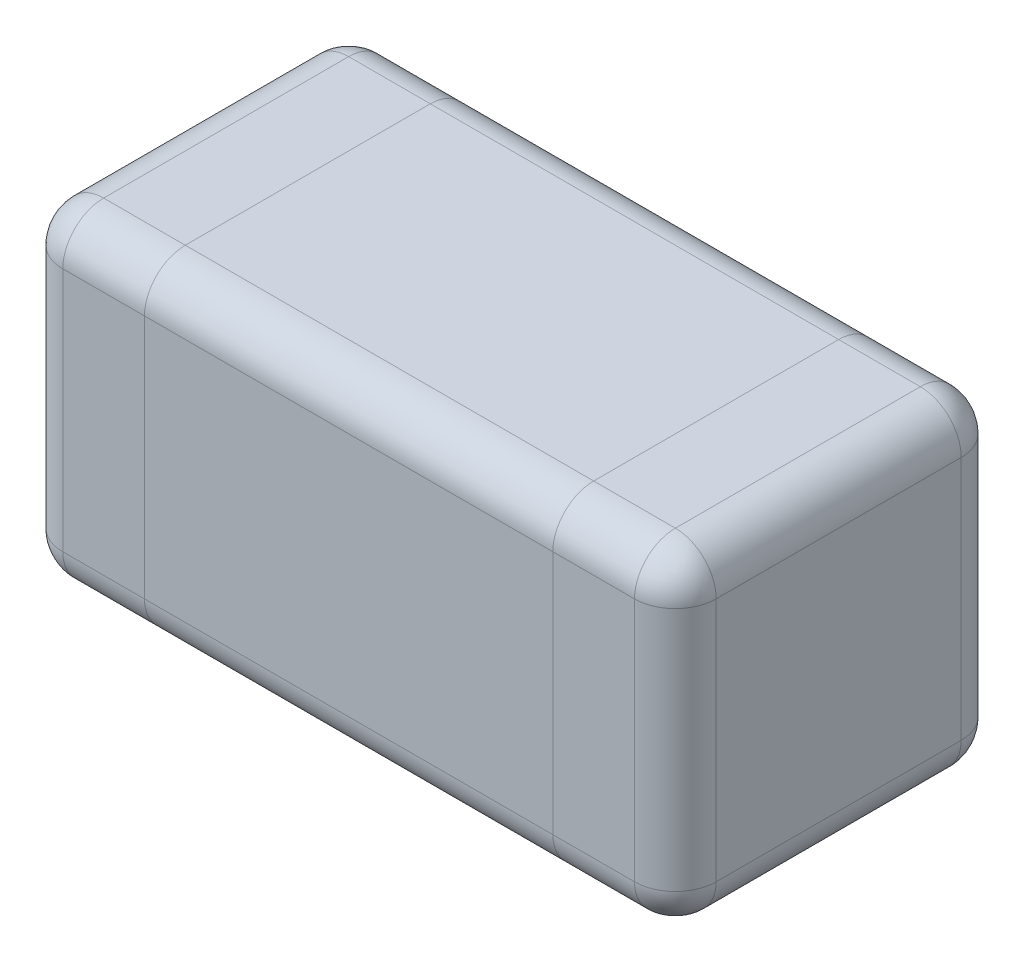
ISO-10303-21;
HEADER;
FILE_DESCRIPTION(('STEP AP214'),'2;1');
FILE_NAME('part.step','',(''),(''),'','','');
FILE_SCHEMA(('AUTOMOTIVE_DESIGN { 1 0 10303 214 1 1 1 1 }'));
ENDSEC;
DATA;
#1=APPLICATION_CONTEXT('core data for automotive mechanical design processes');
#2=APPLICATION_PROTOCOL_DEFINITION('international standard','automotive_design',2000,#1);
#3=PRODUCT_CONTEXT('',#1,'mechanical');
#4=PRODUCT('Part','Part','',(#3));
#5=PRODUCT_RELATED_PRODUCT_CATEGORY('part','',(#4));
#6=PRODUCT_DEFINITION_FORMATION('','',#4);
#7=PRODUCT_DEFINITION_CONTEXT('part definition',#1,'design');
#8=PRODUCT_DEFINITION('design','',#6,#7);
#9=PRODUCT_DEFINITION_SHAPE('','',#8);
#10=(LENGTH_UNIT() NAMED_UNIT(*) SI_UNIT(.MILLI.,.METRE.));
#11=(NAMED_UNIT(*) PLANE_ANGLE_UNIT() SI_UNIT($,.RADIAN.));
#12=(NAMED_UNIT(*) SI_UNIT($,.STERADIAN.) SOLID_ANGLE_UNIT());
#13=UNCERTAINTY_MEASURE_WITH_UNIT(LENGTH_MEASURE(1.E-05),#10,'distance_accuracy_value','');
#14=(GEOMETRIC_REPRESENTATION_CONTEXT(3) GLOBAL_UNCERTAINTY_ASSIGNED_CONTEXT((#13)) GLOBAL_UNIT_ASSIGNED_CONTEXT((#10,
#11,#12)) REPRESENTATION_CONTEXT('',''));
#15=CARTESIAN_POINT('',(0.,0.,0.));
#16=DIRECTION('',(0.,0.,1.));
#17=DIRECTION('',(1.,0.,0.));
#18=AXIS2_PLACEMENT_3D('',#15,#16,#17);
#19=CARTESIAN_POINT('',(0.7,-0.3,0.7));
#20=DIRECTION('',(0.,1.,0.));
#21=DIRECTION('',(1.,0.,0.));
#22=AXIS2_PLACEMENT_3D('',#19,#20,#21);
#23=SPHERICAL_SURFACE('',#22,0.1);
#24=CARTESIAN_POINT('',(0.7,-0.3,0.7));
#25=DIRECTION('',(0.,0.,1.));
#26=DIRECTION('',(1.,0.,0.));
#27=AXIS2_PLACEMENT_3D('',#24,#25,#26);
#28=CIRCLE('',#27,0.1);
#29=CARTESIAN_POINT('',(0.7,-0.4,0.7));
#30=VERTEX_POINT('',#29);
#31=CARTESIAN_POINT('',(0.8,-0.3,0.7));
#32=VERTEX_POINT('',#31);
#33=EDGE_CURVE('E29',#30,#32,#28,.T.);
#34=ORIENTED_EDGE('',*,*,#33,.T.);
#35=CARTESIAN_POINT('',(0.7,-0.3,0.7));
#36=DIRECTION('',(0.,-1.,0.));
#37=DIRECTION('',(1.,0.,0.));
#38=AXIS2_PLACEMENT_3D('',#35,#36,#37);
#39=CIRCLE('',#38,0.1);
#40=CARTESIAN_POINT('',(0.7,-0.3,0.8));
#41=VERTEX_POINT('',#40);
#42=EDGE_CURVE('E228',#32,#41,#39,.T.);
#43=ORIENTED_EDGE('',*,*,#42,.T.);
#44=CARTESIAN_POINT('',(0.7,-0.3,0.7));
#45=DIRECTION('',(-1.,0.,0.));
#46=DIRECTION('',(0.,0.,1.));
#47=AXIS2_PLACEMENT_3D('',#44,#45,#46);
#48=CIRCLE('',#47,0.1);
#49=EDGE_CURVE('E260',#30,#41,#48,.T.);
#50=ORIENTED_EDGE('',*,*,#49,.F.);
#51=EDGE_LOOP('',(#34,#43,#50));
#52=FACE_BOUND('',#51,.T.);
#53=ADVANCED_FACE('F18',(#52),#23,.T.);
#54=CARTESIAN_POINT('',(0.8,-0.4,0.));
#55=DIRECTION('',(0.,-1.,0.));
#56=DIRECTION('',(-1.,0.,0.));
#57=AXIS2_PLACEMENT_3D('',#54,#55,#56);
#58=PLANE('',#57);
#59=DIRECTION('',(0.,0.,1.));
#60=VECTOR('',#59,1.);
#61=CARTESIAN_POINT('',(0.5,-0.4,0.));
#62=LINE('',#61,#60);
#63=CARTESIAN_POINT('',(0.5,-0.4,0.1));
#64=VERTEX_POINT('',#63);
#65=CARTESIAN_POINT('',(0.5,-0.4,0.7));
#66=VERTEX_POINT('',#65);
#67=EDGE_CURVE('E336',#64,#66,#62,.T.);
#68=ORIENTED_EDGE('',*,*,#67,.F.);
#69=DIRECTION('',(-1.,0.,0.));
#70=VECTOR('',#69,1.);
#71=CARTESIAN_POINT('',(0.8,-0.4,0.1));
#72=LINE('',#71,#70);
#73=CARTESIAN_POINT('',(0.7,-0.4,0.1));
#74=VERTEX_POINT('',#73);
#75=EDGE_CURVE('E317',#74,#64,#72,.T.);
#76=ORIENTED_EDGE('',*,*,#75,.F.);
#77=DIRECTION('',(0.,0.,1.));
#78=VECTOR('',#77,1.);
#79=CARTESIAN_POINT('',(0.7,-0.4,0.));
#80=LINE('',#79,#78);
#81=EDGE_CURVE('E11',#74,#30,#80,.T.);
#82=ORIENTED_EDGE('',*,*,#81,.T.);
#83=DIRECTION('',(-1.,0.,0.));
#84=VECTOR('',#83,1.);
#85=CARTESIAN_POINT('',(0.8,-0.4,0.7));
#86=LINE('',#85,#84);
#87=EDGE_CURVE('E233',#30,#66,#86,.T.);
#88=ORIENTED_EDGE('',*,*,#87,.T.);
#89=EDGE_LOOP('',(#68,#76,#82,#88));
#90=FACE_BOUND('',#89,.T.);
#91=ADVANCED_FACE('F876',(#90),#58,.T.);
#92=CARTESIAN_POINT('',(0.7,-0.3,0.1));
#93=DIRECTION('',(0.,1.,0.));
#94=DIRECTION('',(1.,0.,0.));
#95=AXIS2_PLACEMENT_3D('',#92,#93,#94);
#96=SPHERICAL_SURFACE('',#95,0.1);
#97=CARTESIAN_POINT('',(0.7,-0.3,0.1));
#98=DIRECTION('',(0.,0.,1.));
#99=DIRECTION('',(1.,0.,0.));
#100=AXIS2_PLACEMENT_3D('',#97,#98,#99);
#101=CIRCLE('',#100,0.1);
#102=CARTESIAN_POINT('',(0.8,-0.3,0.1));
#103=VERTEX_POINT('',#102);
#104=EDGE_CURVE('E232',#74,#103,#101,.T.);
#105=ORIENTED_EDGE('',*,*,#104,.F.);
#106=CARTESIAN_POINT('',(0.7,-0.3,0.1));
#107=DIRECTION('',(1.,0.,0.));
#108=DIRECTION('',(0.,0.,-1.));
#109=AXIS2_PLACEMENT_3D('',#106,#107,#108);
#110=CIRCLE('',#109,0.1);
#111=CARTESIAN_POINT('',(0.7,-0.3,0.));
#112=VERTEX_POINT('',#111);
#113=EDGE_CURVE('E152',#74,#112,#110,.T.);
#114=ORIENTED_EDGE('',*,*,#113,.T.);
#115=CARTESIAN_POINT('',(0.7,-0.3,0.1));
#116=DIRECTION('',(0.,1.,0.));
#117=DIRECTION('',(1.,0.,0.));
#118=AXIS2_PLACEMENT_3D('',#115,#116,#117);
#119=CIRCLE('',#118,0.1);
#120=EDGE_CURVE('E321',#103,#112,#119,.T.);
#121=ORIENTED_EDGE('',*,*,#120,.F.);
#122=EDGE_LOOP('',(#105,#114,#121));
#123=FACE_BOUND('',#122,.T.);
#124=ADVANCED_FACE('F880',(#123),#96,.T.);
#125=CARTESIAN_POINT('',(-0.7,-0.3,0.7));
#126=DIRECTION('',(0.,0.,-1.));
#127=DIRECTION('',(-1.,0.,0.));
#128=AXIS2_PLACEMENT_3D('',#125,#126,#127);
#129=SPHERICAL_SURFACE('',#128,0.1);
#130=CARTESIAN_POINT('',(-0.7,-0.3,0.7));
#131=DIRECTION('',(0.,-1.,0.));
#132=DIRECTION('',(-1.,0.,0.));
#133=AXIS2_PLACEMENT_3D('',#130,#131,#132);
#134=CIRCLE('',#133,0.1);
#135=CARTESIAN_POINT('',(-0.7,-0.3,0.8));
#136=VERTEX_POINT('',#135);
#137=CARTESIAN_POINT('',(-0.8,-0.3,0.7));
#138=VERTEX_POINT('',#137);
#139=EDGE_CURVE('E147',#136,#138,#134,.T.);
#140=ORIENTED_EDGE('',*,*,#139,.T.);
#141=CARTESIAN_POINT('',(-0.7,-0.3,0.7));
#142=DIRECTION('',(0.,0.,1.));
#143=DIRECTION('',(-1.,0.,0.));
#144=AXIS2_PLACEMENT_3D('',#141,#142,#143);
#145=CIRCLE('',#144,0.1);
#146=CARTESIAN_POINT('',(-0.7,-0.4,0.7));
#147=VERTEX_POINT('',#146);
#148=EDGE_CURVE('E141',#138,#147,#145,.T.);
#149=ORIENTED_EDGE('',*,*,#148,.T.);
#150=CARTESIAN_POINT('',(-0.7,-0.3,0.7));
#151=DIRECTION('',(1.,0.,0.));
#152=DIRECTION('',(0.,-1.,0.));
#153=AXIS2_PLACEMENT_3D('',#150,#151,#152);
#154=CIRCLE('',#153,0.1);
#155=EDGE_CURVE('E145',#136,#147,#154,.T.);
#156=ORIENTED_EDGE('',*,*,#155,.F.);
#157=EDGE_LOOP('',(#140,#149,#156));
#158=FACE_BOUND('',#157,.T.);
#159=ADVANCED_FACE('F143',(#158),#129,.T.);
#160=CARTESIAN_POINT('',(-0.5,-0.4,0.));
#161=DIRECTION('',(0.,-1.,0.));
#162=DIRECTION('',(0.,0.,-1.));
#163=AXIS2_PLACEMENT_3D('',#160,#161,#162);
#164=PLANE('',#163);
#165=DIRECTION('',(0.,0.,1.));
#166=VECTOR('',#165,1.);
#167=CARTESIAN_POINT('',(-0.5,-0.4,0.));
#168=LINE('',#167,#166);
#169=CARTESIAN_POINT('',(-0.5,-0.4,0.1));
#170=VERTEX_POINT('',#169);
#171=CARTESIAN_POINT('',(-0.5,-0.4,0.7));
#172=VERTEX_POINT('',#171);
#173=EDGE_CURVE('E170',#170,#172,#168,.T.);
#174=ORIENTED_EDGE('',*,*,#173,.T.);
#175=DIRECTION('',(-1.,0.,0.));
#176=VECTOR('',#175,1.);
#177=CARTESIAN_POINT('',(-0.5,-0.4,0.7));
#178=LINE('',#177,#176);
#179=EDGE_CURVE('E167',#172,#147,#178,.T.);
#180=ORIENTED_EDGE('',*,*,#179,.T.);
#181=DIRECTION('',(0.,0.,1.));
#182=VECTOR('',#181,1.);
#183=CARTESIAN_POINT('',(-0.7,-0.4,0.));
#184=LINE('',#183,#182);
#185=CARTESIAN_POINT('',(-0.7,-0.4,0.1));
#186=VERTEX_POINT('',#185);
#187=EDGE_CURVE('E153',#186,#147,#184,.T.);
#188=ORIENTED_EDGE('',*,*,#187,.F.);
#189=DIRECTION('',(-1.,0.,0.));
#190=VECTOR('',#189,1.);
#191=CARTESIAN_POINT('',(-0.5,-0.4,0.1));
#192=LINE('',#191,#190);
#193=EDGE_CURVE('E205',#170,#186,#192,.T.);
#194=ORIENTED_EDGE('',*,*,#193,.F.);
#195=EDGE_LOOP('',(#174,#180,#188,#194));
#196=FACE_BOUND('',#195,.T.);
#197=ADVANCED_FACE('F168',(#196),#164,.T.);
#198=CARTESIAN_POINT('',(-0.7,-0.3,0.1));
#199=DIRECTION('',(0.,1.,0.));
#200=DIRECTION('',(-1.,0.,0.));
#201=AXIS2_PLACEMENT_3D('',#198,#199,#200);
#202=SPHERICAL_SURFACE('',#201,0.1);
#203=CARTESIAN_POINT('',(-0.7,-0.3,0.1));
#204=DIRECTION('',(0.,0.,-1.));
#205=DIRECTION('',(-1.,0.,0.));
#206=AXIS2_PLACEMENT_3D('',#203,#204,#205);
#207=CIRCLE('',#206,0.1);
#208=CARTESIAN_POINT('',(-0.8,-0.3,0.1));
#209=VERTEX_POINT('',#208);
#210=EDGE_CURVE('E159',#186,#209,#207,.T.);
#211=ORIENTED_EDGE('',*,*,#210,.T.);
#212=CARTESIAN_POINT('',(-0.7,-0.3,0.1));
#213=DIRECTION('',(0.,-1.,0.));
#214=DIRECTION('',(-1.,0.,0.));
#215=AXIS2_PLACEMENT_3D('',#212,#213,#214);
#216=CIRCLE('',#215,0.1);
#217=CARTESIAN_POINT('',(-0.7,-0.3,0.));
#218=VERTEX_POINT('',#217);
#219=EDGE_CURVE('E290',#209,#218,#216,.T.);
#220=ORIENTED_EDGE('',*,*,#219,.T.);
#221=CARTESIAN_POINT('',(-0.7,-0.3,0.1));
#222=DIRECTION('',(1.,0.,0.));
#223=DIRECTION('',(0.,0.,-1.));
#224=AXIS2_PLACEMENT_3D('',#221,#222,#223);
#225=CIRCLE('',#224,0.1);
#226=EDGE_CURVE('E186',#186,#218,#225,.T.);
#227=ORIENTED_EDGE('',*,*,#226,.F.);
#228=EDGE_LOOP('',(#211,#220,#227));
#229=FACE_BOUND('',#228,.T.);
#230=ADVANCED_FACE('F908',(#229),#202,.T.);
#231=CARTESIAN_POINT('',(0.7,-0.3,0.));
#232=DIRECTION('',(0.,0.,1.));
#233=DIRECTION('',(0.,-1.,0.));
#234=AXIS2_PLACEMENT_3D('',#231,#232,#233);
#235=CYLINDRICAL_SURFACE('',#234,0.1);
#236=ORIENTED_EDGE('',*,*,#104,.T.);
#237=DIRECTION('',(0.,0.,1.));
#238=VECTOR('',#237,1.);
#239=CARTESIAN_POINT('',(0.8,-0.3,0.));
#240=LINE('',#239,#238);
#241=EDGE_CURVE('E286',#103,#32,#240,.T.);
#242=ORIENTED_EDGE('',*,*,#241,.T.);
#243=ORIENTED_EDGE('',*,*,#33,.F.);
#244=ORIENTED_EDGE('',*,*,#81,.F.);
#245=EDGE_LOOP('',(#236,#242,#243,#244));
#246=FACE_BOUND('',#245,.T.);
#247=ADVANCED_FACE('F871',(#246),#235,.T.);
#248=CARTESIAN_POINT('',(0.7,0.4,0.7));
#249=DIRECTION('',(0.,-1.,0.));
#250=DIRECTION('',(1.,0.,0.));
#251=AXIS2_PLACEMENT_3D('',#248,#249,#250);
#252=CYLINDRICAL_SURFACE('',#251,0.1);
#253=DIRECTION('',(0.,-1.,0.));
#254=VECTOR('',#253,1.);
#255=CARTESIAN_POINT('',(0.8,0.4,0.7));
#256=LINE('',#255,#254);
#257=CARTESIAN_POINT('',(0.8,0.3,0.7));
#258=VERTEX_POINT('',#257);
#259=EDGE_CURVE('E22',#258,#32,#256,.T.);
#260=ORIENTED_EDGE('',*,*,#259,.F.);
#261=CARTESIAN_POINT('',(0.7,0.3,0.7));
#262=DIRECTION('',(0.,-1.,0.));
#263=DIRECTION('',(1.,0.,0.));
#264=AXIS2_PLACEMENT_3D('',#261,#262,#263);
#265=CIRCLE('',#264,0.1);
#266=CARTESIAN_POINT('',(0.7,0.3,0.8));
#267=VERTEX_POINT('',#266);
#268=EDGE_CURVE('E326',#258,#267,#265,.T.);
#269=ORIENTED_EDGE('',*,*,#268,.T.);
#270=DIRECTION('',(0.,-1.,0.));
#271=VECTOR('',#270,1.);
#272=CARTESIAN_POINT('',(0.7,0.4,0.8));
#273=LINE('',#272,#271);
#274=EDGE_CURVE('E245',#267,#41,#273,.T.);
#275=ORIENTED_EDGE('',*,*,#274,.T.);
#276=ORIENTED_EDGE('',*,*,#42,.F.);
#277=EDGE_LOOP('',(#260,#269,#275,#276));
#278=FACE_BOUND('',#277,.T.);
#279=ADVANCED_FACE('F867',(#278),#252,.T.);
#280=CARTESIAN_POINT('',(0.8,-0.3,0.7));
#281=DIRECTION('',(-1.,0.,0.));
#282=DIRECTION('',(0.,-1.,0.));
#283=AXIS2_PLACEMENT_3D('',#280,#281,#282);
#284=CYLINDRICAL_SURFACE('',#283,0.1);
#285=ORIENTED_EDGE('',*,*,#49,.T.);
#286=DIRECTION('',(-1.,0.,0.));
#287=VECTOR('',#286,1.);
#288=CARTESIAN_POINT('',(0.8,-0.3,0.8));
#289=LINE('',#288,#287);
#290=CARTESIAN_POINT('',(0.5,-0.3,0.8));
#291=VERTEX_POINT('',#290);
#292=EDGE_CURVE('E250',#41,#291,#289,.T.);
#293=ORIENTED_EDGE('',*,*,#292,.T.);
#294=CARTESIAN_POINT('',(0.5,-0.3,0.7));
#295=DIRECTION('',(-1.,0.,0.));
#296=DIRECTION('',(0.,0.,-1.));
#297=AXIS2_PLACEMENT_3D('',#294,#295,#296);
#298=CIRCLE('',#297,0.1);
#299=EDGE_CURVE('E249',#66,#291,#298,.T.);
#300=ORIENTED_EDGE('',*,*,#299,.F.);
#301=ORIENTED_EDGE('',*,*,#87,.F.);
#302=EDGE_LOOP('',(#285,#293,#300,#301));
#303=FACE_BOUND('',#302,.T.);
#304=ADVANCED_FACE('F836',(#303),#284,.T.);
#305=CARTESIAN_POINT('',(0.5,-0.4,0.));
#306=DIRECTION('',(0.,-1.,0.));
#307=DIRECTION('',(0.,0.,-1.));
#308=AXIS2_PLACEMENT_3D('',#305,#306,#307);
#309=PLANE('',#308);
#310=ORIENTED_EDGE('',*,*,#67,.T.);
#311=DIRECTION('',(-1.,0.,0.));
#312=VECTOR('',#311,1.);
#313=CARTESIAN_POINT('',(0.5,-0.4,0.7));
#314=LINE('',#313,#312);
#315=EDGE_CURVE('E345',#66,#172,#314,.T.);
#316=ORIENTED_EDGE('',*,*,#315,.T.);
#317=ORIENTED_EDGE('',*,*,#173,.F.);
#318=DIRECTION('',(-1.,0.,0.));
#319=VECTOR('',#318,1.);
#320=CARTESIAN_POINT('',(0.5,-0.4,0.1));
#321=LINE('',#320,#319);
#322=EDGE_CURVE('E221',#64,#170,#321,.T.);
#323=ORIENTED_EDGE('',*,*,#322,.F.);
#324=EDGE_LOOP('',(#310,#316,#317,#323));
#325=FACE_BOUND('',#324,.T.);
#326=ADVANCED_FACE('F829',(#325),#309,.T.);
#327=CARTESIAN_POINT('',(0.7,0.4,0.1));
#328=DIRECTION('',(0.,-1.,0.));
#329=DIRECTION('',(1.,0.,0.));
#330=AXIS2_PLACEMENT_3D('',#327,#328,#329);
#331=CYLINDRICAL_SURFACE('',#330,0.1);
#332=DIRECTION('',(0.,-1.,0.));
#333=VECTOR('',#332,1.);
#334=CARTESIAN_POINT('',(0.8,0.4,0.1));
#335=LINE('',#334,#333);
#336=CARTESIAN_POINT('',(0.8,0.3,0.1));
#337=VERTEX_POINT('',#336);
#338=EDGE_CURVE('E322',#337,#103,#335,.T.);
#339=ORIENTED_EDGE('',*,*,#338,.T.);
#340=ORIENTED_EDGE('',*,*,#120,.T.);
#341=DIRECTION('',(0.,-1.,0.));
#342=VECTOR('',#341,1.);
#343=CARTESIAN_POINT('',(0.7,0.4,0.));
#344=LINE('',#343,#342);
#345=CARTESIAN_POINT('',(0.7,0.3,0.));
#346=VERTEX_POINT('',#345);
#347=EDGE_CURVE('E272',#346,#112,#344,.T.);
#348=ORIENTED_EDGE('',*,*,#347,.F.);
#349=CARTESIAN_POINT('',(0.7,0.3,0.1));
#350=DIRECTION('',(0.,1.,0.));
#351=DIRECTION('',(1.,0.,0.));
#352=AXIS2_PLACEMENT_3D('',#349,#350,#351);
#353=CIRCLE('',#352,0.1);
#354=EDGE_CURVE('E220',#337,#346,#353,.T.);
#355=ORIENTED_EDGE('',*,*,#354,.F.);
#356=EDGE_LOOP('',(#339,#340,#348,#355));
#357=FACE_BOUND('',#356,.T.);
#358=ADVANCED_FACE('F835',(#357),#331,.T.);
#359=CARTESIAN_POINT('',(0.8,-0.3,0.1));
#360=DIRECTION('',(-1.,0.,0.));
#361=DIRECTION('',(0.,-1.,0.));
#362=AXIS2_PLACEMENT_3D('',#359,#360,#361);
#363=CYLINDRICAL_SURFACE('',#362,0.1);
#364=ORIENTED_EDGE('',*,*,#113,.F.);
#365=ORIENTED_EDGE('',*,*,#75,.T.);
#366=CARTESIAN_POINT('',(0.5,-0.3,0.1));
#367=DIRECTION('',(1.,0.,0.));
#368=DIRECTION('',(0.,0.,-1.));
#369=AXIS2_PLACEMENT_3D('',#366,#367,#368);
#370=CIRCLE('',#369,0.1);
#371=CARTESIAN_POINT('',(0.5,-0.3,0.));
#372=VERTEX_POINT('',#371);
#373=EDGE_CURVE('E423',#64,#372,#370,.T.);
#374=ORIENTED_EDGE('',*,*,#373,.T.);
#375=DIRECTION('',(-1.,0.,0.));
#376=VECTOR('',#375,1.);
#377=CARTESIAN_POINT('',(0.8,-0.3,0.));
#378=LINE('',#377,#376);
#379=EDGE_CURVE('E342',#112,#372,#378,.T.);
#380=ORIENTED_EDGE('',*,*,#379,.F.);
#381=EDGE_LOOP('',(#364,#365,#374,#380));
#382=FACE_BOUND('',#381,.T.);
#383=ADVANCED_FACE('F894',(#382),#363,.T.);
#384=CARTESIAN_POINT('',(-0.7,-0.3,0.));
#385=DIRECTION('',(0.,0.,1.));
#386=DIRECTION('',(0.,-1.,0.));
#387=AXIS2_PLACEMENT_3D('',#384,#385,#386);
#388=CYLINDRICAL_SURFACE('',#387,0.1);
#389=ORIENTED_EDGE('',*,*,#210,.F.);
#390=ORIENTED_EDGE('',*,*,#187,.T.);
#391=ORIENTED_EDGE('',*,*,#148,.F.);
#392=DIRECTION('',(0.,0.,1.));
#393=VECTOR('',#392,1.);
#394=CARTESIAN_POINT('',(-0.8,-0.3,0.));
#395=LINE('',#394,#393);
#396=EDGE_CURVE('E273',#209,#138,#395,.T.);
#397=ORIENTED_EDGE('',*,*,#396,.F.);
#398=EDGE_LOOP('',(#389,#390,#391,#397));
#399=FACE_BOUND('',#398,.T.);
#400=ADVANCED_FACE('F157',(#399),#388,.T.);
#401=CARTESIAN_POINT('',(-0.5,-0.3,0.7));
#402=DIRECTION('',(-1.,0.,0.));
#403=DIRECTION('',(0.,-1.,0.));
#404=AXIS2_PLACEMENT_3D('',#401,#402,#403);
#405=CYLINDRICAL_SURFACE('',#404,0.1);
#406=CARTESIAN_POINT('',(-0.5,-0.3,0.7));
#407=DIRECTION('',(-1.,0.,0.));
#408=DIRECTION('',(0.,0.,-1.));
#409=AXIS2_PLACEMENT_3D('',#406,#407,#408);
#410=CIRCLE('',#409,0.1);
#411=CARTESIAN_POINT('',(-0.5,-0.3,0.8));
#412=VERTEX_POINT('',#411);
#413=EDGE_CURVE('E348',#172,#412,#410,.T.);
#414=ORIENTED_EDGE('',*,*,#413,.T.);
#415=DIRECTION('',(-1.,0.,0.));
#416=VECTOR('',#415,1.);
#417=CARTESIAN_POINT('',(-0.5,-0.3,0.8));
#418=LINE('',#417,#416);
#419=EDGE_CURVE('E178',#412,#136,#418,.T.);
#420=ORIENTED_EDGE('',*,*,#419,.T.);
#421=ORIENTED_EDGE('',*,*,#155,.T.);
#422=ORIENTED_EDGE('',*,*,#179,.F.);
#423=EDGE_LOOP('',(#414,#420,#421,#422));
#424=FACE_BOUND('',#423,.T.);
#425=ADVANCED_FACE('F176',(#424),#405,.T.);
#426=CARTESIAN_POINT('',(-0.7,-0.4,0.7));
#427=DIRECTION('',(0.,1.,0.));
#428=DIRECTION('',(-1.,0.,0.));
#429=AXIS2_PLACEMENT_3D('',#426,#427,#428);
#430=CYLINDRICAL_SURFACE('',#429,0.1);
#431=ORIENTED_EDGE('',*,*,#139,.F.);
#432=DIRECTION('',(0.,1.,0.));
#433=VECTOR('',#432,1.);
#434=CARTESIAN_POINT('',(-0.7,-0.4,0.8));
#435=LINE('',#434,#433);
#436=CARTESIAN_POINT('',(-0.7,0.3,0.8));
#437=VERTEX_POINT('',#436);
#438=EDGE_CURVE('E190',#136,#437,#435,.T.);
#439=ORIENTED_EDGE('',*,*,#438,.T.);
#440=CARTESIAN_POINT('',(-0.7,0.3,0.7));
#441=DIRECTION('',(0.,-1.,0.));
#442=DIRECTION('',(-1.,0.,0.));
#443=AXIS2_PLACEMENT_3D('',#440,#441,#442);
#444=CIRCLE('',#443,0.1);
#445=CARTESIAN_POINT('',(-0.8,0.3,0.7));
#446=VERTEX_POINT('',#445);
#447=EDGE_CURVE('E251',#437,#446,#444,.T.);
#448=ORIENTED_EDGE('',*,*,#447,.T.);
#449=DIRECTION('',(0.,1.,0.));
#450=VECTOR('',#449,1.);
#451=CARTESIAN_POINT('',(-0.8,-0.4,0.7));
#452=LINE('',#451,#450);
#453=EDGE_CURVE('E268',#138,#446,#452,.T.);
#454=ORIENTED_EDGE('',*,*,#453,.F.);
#455=EDGE_LOOP('',(#431,#439,#448,#454));
#456=FACE_BOUND('',#455,.T.);
#457=ADVANCED_FACE('F898',(#456),#430,.T.);
#458=CARTESIAN_POINT('',(-0.5,-0.3,0.1));
#459=DIRECTION('',(-1.,0.,0.));
#460=DIRECTION('',(0.,-1.,0.));
#461=AXIS2_PLACEMENT_3D('',#458,#459,#460);
#462=CYLINDRICAL_SURFACE('',#461,0.1);
#463=CARTESIAN_POINT('',(-0.5,-0.3,0.1));
#464=DIRECTION('',(1.,0.,0.));
#465=DIRECTION('',(0.,0.,-1.));
#466=AXIS2_PLACEMENT_3D('',#463,#464,#465);
#467=CIRCLE('',#466,0.1);
#468=CARTESIAN_POINT('',(-0.5,-0.3,0.));
#469=VERTEX_POINT('',#468);
#470=EDGE_CURVE('E217',#170,#469,#467,.T.);
#471=ORIENTED_EDGE('',*,*,#470,.F.);
#472=ORIENTED_EDGE('',*,*,#193,.T.);
#473=ORIENTED_EDGE('',*,*,#226,.T.);
#474=DIRECTION('',(-1.,0.,0.));
#475=VECTOR('',#474,1.);
#476=CARTESIAN_POINT('',(-0.5,-0.3,0.));
#477=LINE('',#476,#475);
#478=EDGE_CURVE('E234',#469,#218,#477,.T.);
#479=ORIENTED_EDGE('',*,*,#478,.F.);
#480=EDGE_LOOP('',(#471,#472,#473,#479));
#481=FACE_BOUND('',#480,.T.);
#482=ADVANCED_FACE('F902',(#481),#462,.T.);
#483=CARTESIAN_POINT('',(-0.7,-0.4,0.1));
#484=DIRECTION('',(0.,1.,0.));
#485=DIRECTION('',(-1.,0.,0.));
#486=AXIS2_PLACEMENT_3D('',#483,#484,#485);
#487=CYLINDRICAL_SURFACE('',#486,0.1);
#488=DIRECTION('',(0.,1.,0.));
#489=VECTOR('',#488,1.);
#490=CARTESIAN_POINT('',(-0.8,-0.4,0.1));
#491=LINE('',#490,#489);
#492=CARTESIAN_POINT('',(-0.8,0.3,0.1));
#493=VERTEX_POINT('',#492);
#494=EDGE_CURVE('E377',#209,#493,#491,.T.);
#495=ORIENTED_EDGE('',*,*,#494,.T.);
#496=CARTESIAN_POINT('',(-0.7,0.3,0.1));
#497=DIRECTION('',(0.,-1.,0.));
#498=DIRECTION('',(-1.,0.,0.));
#499=AXIS2_PLACEMENT_3D('',#496,#497,#498);
#500=CIRCLE('',#499,0.1);
#501=CARTESIAN_POINT('',(-0.7,0.3,0.));
#502=VERTEX_POINT('',#501);
#503=EDGE_CURVE('E225',#493,#502,#500,.T.);
#504=ORIENTED_EDGE('',*,*,#503,.T.);
#505=DIRECTION('',(0.,1.,0.));
#506=VECTOR('',#505,1.);
#507=CARTESIAN_POINT('',(-0.7,-0.4,0.));
#508=LINE('',#507,#506);
#509=EDGE_CURVE('E238',#218,#502,#508,.T.);
#510=ORIENTED_EDGE('',*,*,#509,.F.);
#511=ORIENTED_EDGE('',*,*,#219,.F.);
#512=EDGE_LOOP('',(#495,#504,#510,#511));
#513=FACE_BOUND('',#512,.T.);
#514=ADVANCED_FACE('F375',(#513),#487,.T.);
#515=CARTESIAN_POINT('',(0.8,0.4,0.));
#516=DIRECTION('',(1.,0.,0.));
#517=DIRECTION('',(0.,-1.,0.));
#518=AXIS2_PLACEMENT_3D('',#515,#516,#517);
#519=PLANE('',#518);
#520=ORIENTED_EDGE('',*,*,#338,.F.);
#521=DIRECTION('',(0.,0.,1.));
#522=VECTOR('',#521,1.);
#523=CARTESIAN_POINT('',(0.8,0.3,0.));
#524=LINE('',#523,#522);
#525=EDGE_CURVE('E222',#337,#258,#524,.T.);
#526=ORIENTED_EDGE('',*,*,#525,.T.);
#527=ORIENTED_EDGE('',*,*,#259,.T.);
#528=ORIENTED_EDGE('',*,*,#241,.F.);
#529=EDGE_LOOP('',(#520,#526,#527,#528));
#530=FACE_BOUND('',#529,.T.);
#531=ADVANCED_FACE('F859',(#530),#519,.T.);
#532=CARTESIAN_POINT('',(0.7,0.3,0.7));
#533=DIRECTION('',(0.,-1.,0.));
#534=DIRECTION('',(1.,0.,0.));
#535=AXIS2_PLACEMENT_3D('',#532,#533,#534);
#536=SPHERICAL_SURFACE('',#535,0.1);
#537=CARTESIAN_POINT('',(0.7,0.3,0.7));
#538=DIRECTION('',(0.,0.,-1.));
#539=DIRECTION('',(1.,0.,0.));
#540=AXIS2_PLACEMENT_3D('',#537,#538,#539);
#541=CIRCLE('',#540,0.1);
#542=CARTESIAN_POINT('',(0.7,0.4,0.7));
#543=VERTEX_POINT('',#542);
#544=EDGE_CURVE('E226',#543,#258,#541,.T.);
#545=ORIENTED_EDGE('',*,*,#544,.F.);
#546=CARTESIAN_POINT('',(0.7,0.3,0.7));
#547=DIRECTION('',(1.,0.,0.));
#548=DIRECTION('',(0.,0.,1.));
#549=AXIS2_PLACEMENT_3D('',#546,#547,#548);
#550=CIRCLE('',#549,0.1);
#551=EDGE_CURVE('E211',#543,#267,#550,.T.);
#552=ORIENTED_EDGE('',*,*,#551,.T.);
#553=ORIENTED_EDGE('',*,*,#268,.F.);
#554=EDGE_LOOP('',(#545,#552,#553));
#555=FACE_BOUND('',#554,.T.);
#556=ADVANCED_FACE('F819',(#555),#536,.T.);
#557=CARTESIAN_POINT('',(0.5,-0.3,0.7));
#558=DIRECTION('',(-1.,0.,0.));
#559=DIRECTION('',(0.,-1.,0.));
#560=AXIS2_PLACEMENT_3D('',#557,#558,#559);
#561=CYLINDRICAL_SURFACE('',#560,0.1);
#562=ORIENTED_EDGE('',*,*,#299,.T.);
#563=DIRECTION('',(-1.,0.,0.));
#564=VECTOR('',#563,1.);
#565=CARTESIAN_POINT('',(0.5,-0.3,0.8));
#566=LINE('',#565,#564);
#567=EDGE_CURVE('E255',#291,#412,#566,.T.);
#568=ORIENTED_EDGE('',*,*,#567,.T.);
#569=ORIENTED_EDGE('',*,*,#413,.F.);
#570=ORIENTED_EDGE('',*,*,#315,.F.);
#571=EDGE_LOOP('',(#562,#568,#569,#570));
#572=FACE_BOUND('',#571,.T.);
#573=ADVANCED_FACE('F812',(#572),#561,.T.);
#574=CARTESIAN_POINT('',(0.65,0.,0.8));
#575=DIRECTION('',(0.,0.,-1.));
#576=DIRECTION('',(0.,-1.,0.));
#577=AXIS2_PLACEMENT_3D('',#574,#575,#576);
#578=PLANE('',#577);
#579=DIRECTION('',(0.,-1.,0.));
#580=VECTOR('',#579,1.);
#581=CARTESIAN_POINT('',(0.5,0.4,0.8));
#582=LINE('',#581,#580);
#583=CARTESIAN_POINT('',(0.5,0.3,0.8));
#584=VERTEX_POINT('',#583);
#585=EDGE_CURVE('E327',#584,#291,#582,.T.);
#586=ORIENTED_EDGE('',*,*,#585,.T.);
#587=ORIENTED_EDGE('',*,*,#292,.F.);
#588=ORIENTED_EDGE('',*,*,#274,.F.);
#589=DIRECTION('',(1.,0.,0.));
#590=VECTOR('',#589,1.);
#591=CARTESIAN_POINT('',(0.5,0.3,0.8));
#592=LINE('',#591,#590);
#593=EDGE_CURVE('E216',#584,#267,#592,.T.);
#594=ORIENTED_EDGE('',*,*,#593,.F.);
#595=EDGE_LOOP('',(#586,#587,#588,#594));
#596=FACE_BOUND('',#595,.T.);
#597=ADVANCED_FACE('F818',(#596),#578,.F.);
#598=CARTESIAN_POINT('',(0.7,0.3,0.1));
#599=DIRECTION('',(0.,-1.,0.));
#600=DIRECTION('',(1.,0.,0.));
#601=AXIS2_PLACEMENT_3D('',#598,#599,#600);
#602=SPHERICAL_SURFACE('',#601,0.1);
#603=CARTESIAN_POINT('',(0.7,0.3,0.1));
#604=DIRECTION('',(0.,0.,-1.));
#605=DIRECTION('',(1.,0.,0.));
#606=AXIS2_PLACEMENT_3D('',#603,#604,#605);
#607=CIRCLE('',#606,0.1);
#608=CARTESIAN_POINT('',(0.7,0.4,0.1));
#609=VERTEX_POINT('',#608);
#610=EDGE_CURVE('E215',#609,#337,#607,.T.);
#611=ORIENTED_EDGE('',*,*,#610,.T.);
#612=ORIENTED_EDGE('',*,*,#354,.T.);
#613=CARTESIAN_POINT('',(0.7,0.3,0.1));
#614=DIRECTION('',(-1.,0.,0.));
#615=DIRECTION('',(0.,0.,-1.));
#616=AXIS2_PLACEMENT_3D('',#613,#614,#615);
#617=CIRCLE('',#616,0.1);
#618=EDGE_CURVE('E192',#609,#346,#617,.T.);
#619=ORIENTED_EDGE('',*,*,#618,.F.);
#620=EDGE_LOOP('',(#611,#612,#619));
#621=FACE_BOUND('',#620,.T.);
#622=ADVANCED_FACE('F802',(#621),#602,.T.);
#623=CARTESIAN_POINT('',(0.5,-0.3,0.1));
#624=DIRECTION('',(-1.,0.,0.));
#625=DIRECTION('',(0.,-1.,0.));
#626=AXIS2_PLACEMENT_3D('',#623,#624,#625);
#627=CYLINDRICAL_SURFACE('',#626,0.1);
#628=ORIENTED_EDGE('',*,*,#373,.F.);
#629=ORIENTED_EDGE('',*,*,#322,.T.);
#630=ORIENTED_EDGE('',*,*,#470,.T.);
#631=DIRECTION('',(-1.,0.,0.));
#632=VECTOR('',#631,1.);
#633=CARTESIAN_POINT('',(0.5,-0.3,0.));
#634=LINE('',#633,#632);
#635=EDGE_CURVE('E351',#372,#469,#634,.T.);
#636=ORIENTED_EDGE('',*,*,#635,.F.);
#637=EDGE_LOOP('',(#628,#629,#630,#636));
#638=FACE_BOUND('',#637,.T.);
#639=ADVANCED_FACE('F20',(#638),#627,.T.);
#640=CARTESIAN_POINT('',(0.65,0.,0.));
#641=DIRECTION('',(0.,0.,-1.));
#642=DIRECTION('',(0.,-1.,0.));
#643=AXIS2_PLACEMENT_3D('',#640,#641,#642);
#644=PLANE('',#643);
#645=DIRECTION('',(0.,-1.,0.));
#646=VECTOR('',#645,1.);
#647=CARTESIAN_POINT('',(0.5,0.4,0.));
#648=LINE('',#647,#646);
#649=CARTESIAN_POINT('',(0.5,0.3,0.));
#650=VERTEX_POINT('',#649);
#651=EDGE_CURVE('E301',#650,#372,#648,.T.);
#652=ORIENTED_EDGE('',*,*,#651,.F.);
#653=DIRECTION('',(1.,0.,0.));
#654=VECTOR('',#653,1.);
#655=CARTESIAN_POINT('',(0.5,0.3,0.));
#656=LINE('',#655,#654);
#657=EDGE_CURVE('E196',#650,#346,#656,.T.);
#658=ORIENTED_EDGE('',*,*,#657,.T.);
#659=ORIENTED_EDGE('',*,*,#347,.T.);
#660=ORIENTED_EDGE('',*,*,#379,.T.);
#661=EDGE_LOOP('',(#652,#658,#659,#660));
#662=FACE_BOUND('',#661,.T.);
#663=ADVANCED_FACE('F801',(#662),#644,.T.);
#664=CARTESIAN_POINT('',(-0.8,-0.4,0.));
#665=DIRECTION('',(-1.,0.,0.));
#666=DIRECTION('',(0.,0.,1.));
#667=AXIS2_PLACEMENT_3D('',#664,#665,#666);
#668=PLANE('',#667);
#669=ORIENTED_EDGE('',*,*,#494,.F.);
#670=ORIENTED_EDGE('',*,*,#396,.T.);
#671=ORIENTED_EDGE('',*,*,#453,.T.);
#672=DIRECTION('',(0.,0.,1.));
#673=VECTOR('',#672,1.);
#674=CARTESIAN_POINT('',(-0.8,0.3,0.));
#675=LINE('',#674,#673);
#676=EDGE_CURVE('E302',#493,#446,#675,.T.);
#677=ORIENTED_EDGE('',*,*,#676,.F.);
#678=EDGE_LOOP('',(#669,#670,#671,#677));
#679=FACE_BOUND('',#678,.T.);
#680=ADVANCED_FACE('F969',(#679),#668,.T.);
#681=CARTESIAN_POINT('',(-0.65,0.,0.8));
#682=DIRECTION('',(0.,0.,-1.));
#683=DIRECTION('',(0.,-1.,0.));
#684=AXIS2_PLACEMENT_3D('',#681,#682,#683);
#685=PLANE('',#684);
#686=DIRECTION('',(0.,1.,0.));
#687=VECTOR('',#686,1.);
#688=CARTESIAN_POINT('',(-0.5,-0.4,0.8));
#689=LINE('',#688,#687);
#690=CARTESIAN_POINT('',(-0.5,0.3,0.8));
#691=VERTEX_POINT('',#690);
#692=EDGE_CURVE('E259',#412,#691,#689,.T.);
#693=ORIENTED_EDGE('',*,*,#692,.T.);
#694=DIRECTION('',(1.,0.,0.));
#695=VECTOR('',#694,1.);
#696=CARTESIAN_POINT('',(-0.8,0.3,0.8));
#697=LINE('',#696,#695);
#698=EDGE_CURVE('E243',#437,#691,#697,.T.);
#699=ORIENTED_EDGE('',*,*,#698,.F.);
#700=ORIENTED_EDGE('',*,*,#438,.F.);
#701=ORIENTED_EDGE('',*,*,#419,.F.);
#702=EDGE_LOOP('',(#693,#699,#700,#701));
#703=FACE_BOUND('',#702,.T.);
#704=ADVANCED_FACE('F964',(#703),#685,.F.);
#705=CARTESIAN_POINT('',(-0.7,0.3,0.7));
#706=DIRECTION('',(0.,0.,-1.));
#707=DIRECTION('',(-1.,0.,0.));
#708=AXIS2_PLACEMENT_3D('',#705,#706,#707);
#709=SPHERICAL_SURFACE('',#708,0.1);
#710=ORIENTED_EDGE('',*,*,#447,.F.);
#711=CARTESIAN_POINT('',(-0.7,0.3,0.7));
#712=DIRECTION('',(-1.,0.,0.));
#713=DIRECTION('',(0.,1.,0.));
#714=AXIS2_PLACEMENT_3D('',#711,#712,#713);
#715=CIRCLE('',#714,0.1);
#716=CARTESIAN_POINT('',(-0.7,0.4,0.7));
#717=VERTEX_POINT('',#716);
#718=EDGE_CURVE('E239',#437,#717,#715,.T.);
#719=ORIENTED_EDGE('',*,*,#718,.T.);
#720=CARTESIAN_POINT('',(-0.7,0.3,0.7));
#721=DIRECTION('',(0.,0.,-1.));
#722=DIRECTION('',(-1.,0.,0.));
#723=AXIS2_PLACEMENT_3D('',#720,#721,#722);
#724=CIRCLE('',#723,0.1);
#725=EDGE_CURVE('E297',#446,#717,#724,.T.);
#726=ORIENTED_EDGE('',*,*,#725,.F.);
#727=EDGE_LOOP('',(#710,#719,#726));
#728=FACE_BOUND('',#727,.T.);
#729=ADVANCED_FACE('F960',(#728),#709,.T.);
#730=CARTESIAN_POINT('',(-0.65,0.,0.));
#731=DIRECTION('',(0.,0.,-1.));
#732=DIRECTION('',(0.,-1.,0.));
#733=AXIS2_PLACEMENT_3D('',#730,#731,#732);
#734=PLANE('',#733);
#735=DIRECTION('',(0.,1.,0.));
#736=VECTOR('',#735,1.);
#737=CARTESIAN_POINT('',(-0.5,-0.4,0.));
#738=LINE('',#737,#736);
#739=CARTESIAN_POINT('',(-0.5,0.3,0.));
#740=VERTEX_POINT('',#739);
#741=EDGE_CURVE('E197',#469,#740,#738,.T.);
#742=ORIENTED_EDGE('',*,*,#741,.F.);
#743=ORIENTED_EDGE('',*,*,#478,.T.);
#744=ORIENTED_EDGE('',*,*,#509,.T.);
#745=DIRECTION('',(1.,0.,0.));
#746=VECTOR('',#745,1.);
#747=CARTESIAN_POINT('',(-0.8,0.3,0.));
#748=LINE('',#747,#746);
#749=EDGE_CURVE('E244',#502,#740,#748,.T.);
#750=ORIENTED_EDGE('',*,*,#749,.T.);
#751=EDGE_LOOP('',(#742,#743,#744,#750));
#752=FACE_BOUND('',#751,.T.);
#753=ADVANCED_FACE('F366',(#752),#734,.T.);
#754=CARTESIAN_POINT('',(-0.7,0.3,0.1));
#755=DIRECTION('',(0.,-1.,0.));
#756=DIRECTION('',(-1.,0.,0.));
#757=AXIS2_PLACEMENT_3D('',#754,#755,#756);
#758=SPHERICAL_SURFACE('',#757,0.1);
#759=CARTESIAN_POINT('',(-0.7,0.3,0.1));
#760=DIRECTION('',(0.,0.,1.));
#761=DIRECTION('',(-1.,0.,0.));
#762=AXIS2_PLACEMENT_3D('',#759,#760,#761);
#763=CIRCLE('',#762,0.1);
#764=CARTESIAN_POINT('',(-0.7,0.4,0.1));
#765=VERTEX_POINT('',#764);
#766=EDGE_CURVE('E307',#765,#493,#763,.T.);
#767=ORIENTED_EDGE('',*,*,#766,.F.);
#768=CARTESIAN_POINT('',(-0.7,0.3,0.1));
#769=DIRECTION('',(-1.,0.,0.));
#770=DIRECTION('',(0.,0.,-1.));
#771=AXIS2_PLACEMENT_3D('',#768,#769,#770);
#772=CIRCLE('',#771,0.1);
#773=EDGE_CURVE('E387',#765,#502,#772,.T.);
#774=ORIENTED_EDGE('',*,*,#773,.T.);
#775=ORIENTED_EDGE('',*,*,#503,.F.);
#776=EDGE_LOOP('',(#767,#774,#775));
#777=FACE_BOUND('',#776,.T.);
#778=ADVANCED_FACE('F392',(#777),#758,.T.);
#779=CARTESIAN_POINT('',(0.7,0.3,0.));
#780=DIRECTION('',(0.,0.,1.));
#781=DIRECTION('',(0.,1.,0.));
#782=AXIS2_PLACEMENT_3D('',#779,#780,#781);
#783=CYLINDRICAL_SURFACE('',#782,0.1);
#784=ORIENTED_EDGE('',*,*,#610,.F.);
#785=DIRECTION('',(0.,0.,1.));
#786=VECTOR('',#785,1.);
#787=CARTESIAN_POINT('',(0.7,0.4,0.));
#788=LINE('',#787,#786);
#789=EDGE_CURVE('E291',#609,#543,#788,.T.);
#790=ORIENTED_EDGE('',*,*,#789,.T.);
#791=ORIENTED_EDGE('',*,*,#544,.T.);
#792=ORIENTED_EDGE('',*,*,#525,.F.);
#793=EDGE_LOOP('',(#784,#790,#791,#792));
#794=FACE_BOUND('',#793,.T.);
#795=ADVANCED_FACE('F848',(#794),#783,.T.);
#796=CARTESIAN_POINT('',(0.5,0.3,0.7));
#797=DIRECTION('',(1.,0.,0.));
#798=DIRECTION('',(0.,1.,0.));
#799=AXIS2_PLACEMENT_3D('',#796,#797,#798);
#800=CYLINDRICAL_SURFACE('',#799,0.1);
#801=CARTESIAN_POINT('',(0.5,0.3,0.7));
#802=DIRECTION('',(1.,0.,0.));
#803=DIRECTION('',(0.,0.,1.));
#804=AXIS2_PLACEMENT_3D('',#801,#802,#803);
#805=CIRCLE('',#804,0.1);
#806=CARTESIAN_POINT('',(0.5,0.4,0.7));
#807=VERTEX_POINT('',#806);
#808=EDGE_CURVE('E210',#807,#584,#805,.T.);
#809=ORIENTED_EDGE('',*,*,#808,.T.);
#810=ORIENTED_EDGE('',*,*,#593,.T.);
#811=ORIENTED_EDGE('',*,*,#551,.F.);
#812=DIRECTION('',(1.,0.,0.));
#813=VECTOR('',#812,1.);
#814=CARTESIAN_POINT('',(0.5,0.4,0.7));
#815=LINE('',#814,#813);
#816=EDGE_CURVE('E296',#807,#543,#815,.T.);
#817=ORIENTED_EDGE('',*,*,#816,.F.);
#818=EDGE_LOOP('',(#809,#810,#811,#817));
#819=FACE_BOUND('',#818,.T.);
#820=ADVANCED_FACE('F786',(#819),#800,.T.);
#821=CARTESIAN_POINT('',(0.,0.,0.8));
#822=DIRECTION('',(0.,0.,-1.));
#823=DIRECTION('',(0.,-1.,0.));
#824=AXIS2_PLACEMENT_3D('',#821,#822,#823);
#825=PLANE('',#824);
#826=ORIENTED_EDGE('',*,*,#585,.F.);
#827=DIRECTION('',(1.,0.,0.));
#828=VECTOR('',#827,1.);
#829=CARTESIAN_POINT('',(-0.5,0.3,0.8));
#830=LINE('',#829,#828);
#831=EDGE_CURVE('E202',#691,#584,#830,.T.);
#832=ORIENTED_EDGE('',*,*,#831,.F.);
#833=ORIENTED_EDGE('',*,*,#692,.F.);
#834=ORIENTED_EDGE('',*,*,#567,.F.);
#835=EDGE_LOOP('',(#826,#832,#833,#834));
#836=FACE_BOUND('',#835,.T.);
#837=ADVANCED_FACE('F780',(#836),#825,.F.);
#838=CARTESIAN_POINT('',(0.5,0.3,0.1));
#839=DIRECTION('',(1.,0.,0.));
#840=DIRECTION('',(0.,1.,0.));
#841=AXIS2_PLACEMENT_3D('',#838,#839,#840);
#842=CYLINDRICAL_SURFACE('',#841,0.1);
#843=CARTESIAN_POINT('',(0.5,0.3,0.1));
#844=DIRECTION('',(-1.,0.,0.));
#845=DIRECTION('',(0.,0.,1.));
#846=AXIS2_PLACEMENT_3D('',#843,#844,#845);
#847=CIRCLE('',#846,0.1);
#848=CARTESIAN_POINT('',(0.5,0.4,0.1));
#849=VERTEX_POINT('',#848);
#850=EDGE_CURVE('E267',#849,#650,#847,.T.);
#851=ORIENTED_EDGE('',*,*,#850,.F.);
#852=DIRECTION('',(1.,0.,0.));
#853=VECTOR('',#852,1.);
#854=CARTESIAN_POINT('',(0.5,0.4,0.1));
#855=LINE('',#854,#853);
#856=EDGE_CURVE('E295',#849,#609,#855,.T.);
#857=ORIENTED_EDGE('',*,*,#856,.T.);
#858=ORIENTED_EDGE('',*,*,#618,.T.);
#859=ORIENTED_EDGE('',*,*,#657,.F.);
#860=EDGE_LOOP('',(#851,#857,#858,#859));
#861=FACE_BOUND('',#860,.T.);
#862=ADVANCED_FACE('F769',(#861),#842,.T.);
#863=CARTESIAN_POINT('',(0.,0.,0.));
#864=DIRECTION('',(0.,0.,-1.));
#865=DIRECTION('',(0.,-1.,0.));
#866=AXIS2_PLACEMENT_3D('',#863,#864,#865);
#867=PLANE('',#866);
#868=ORIENTED_EDGE('',*,*,#651,.T.);
#869=ORIENTED_EDGE('',*,*,#635,.T.);
#870=ORIENTED_EDGE('',*,*,#741,.T.);
#871=DIRECTION('',(1.,0.,0.));
#872=VECTOR('',#871,1.);
#873=CARTESIAN_POINT('',(-0.5,0.3,0.));
#874=LINE('',#873,#872);
#875=EDGE_CURVE('E203',#740,#650,#874,.T.);
#876=ORIENTED_EDGE('',*,*,#875,.T.);
#877=EDGE_LOOP('',(#868,#869,#870,#876));
#878=FACE_BOUND('',#877,.T.);
#879=ADVANCED_FACE('F762',(#878),#867,.T.);
#880=CARTESIAN_POINT('',(-0.7,0.3,0.));
#881=DIRECTION('',(0.,0.,1.));
#882=DIRECTION('',(0.,1.,0.));
#883=AXIS2_PLACEMENT_3D('',#880,#881,#882);
#884=CYLINDRICAL_SURFACE('',#883,0.1);
#885=ORIENTED_EDGE('',*,*,#766,.T.);
#886=ORIENTED_EDGE('',*,*,#676,.T.);
#887=ORIENTED_EDGE('',*,*,#725,.T.);
#888=DIRECTION('',(0.,0.,1.));
#889=VECTOR('',#888,1.);
#890=CARTESIAN_POINT('',(-0.7,0.4,0.));
#891=LINE('',#890,#889);
#892=EDGE_CURVE('E315',#765,#717,#891,.T.);
#893=ORIENTED_EDGE('',*,*,#892,.F.);
#894=EDGE_LOOP('',(#885,#886,#887,#893));
#895=FACE_BOUND('',#894,.T.);
#896=ADVANCED_FACE('F768',(#895),#884,.T.);
#897=CARTESIAN_POINT('',(-0.8,0.3,0.7));
#898=DIRECTION('',(1.,0.,0.));
#899=DIRECTION('',(0.,1.,0.));
#900=AXIS2_PLACEMENT_3D('',#897,#898,#899);
#901=CYLINDRICAL_SURFACE('',#900,0.1);
#902=ORIENTED_EDGE('',*,*,#718,.F.);
#903=ORIENTED_EDGE('',*,*,#698,.T.);
#904=CARTESIAN_POINT('',(-0.5,0.3,0.7));
#905=DIRECTION('',(1.,0.,0.));
#906=DIRECTION('',(0.,0.,1.));
#907=AXIS2_PLACEMENT_3D('',#904,#905,#906);
#908=CIRCLE('',#907,0.1);
#909=CARTESIAN_POINT('',(-0.5,0.4,0.7));
#910=VERTEX_POINT('',#909);
#911=EDGE_CURVE('E198',#910,#691,#908,.T.);
#912=ORIENTED_EDGE('',*,*,#911,.F.);
#913=DIRECTION('',(1.,0.,0.));
#914=VECTOR('',#913,1.);
#915=CARTESIAN_POINT('',(-0.8,0.4,0.7));
#916=LINE('',#915,#914);
#917=EDGE_CURVE('E306',#717,#910,#916,.T.);
#918=ORIENTED_EDGE('',*,*,#917,.F.);
#919=EDGE_LOOP('',(#902,#903,#912,#918));
#920=FACE_BOUND('',#919,.T.);
#921=ADVANCED_FACE('F942',(#920),#901,.T.);
#922=CARTESIAN_POINT('',(-0.8,0.3,0.1));
#923=DIRECTION('',(1.,0.,0.));
#924=DIRECTION('',(0.,1.,0.));
#925=AXIS2_PLACEMENT_3D('',#922,#923,#924);
#926=CYLINDRICAL_SURFACE('',#925,0.1);
#927=ORIENTED_EDGE('',*,*,#773,.F.);
#928=DIRECTION('',(1.,0.,0.));
#929=VECTOR('',#928,1.);
#930=CARTESIAN_POINT('',(-0.8,0.4,0.1));
#931=LINE('',#930,#929);
#932=CARTESIAN_POINT('',(-0.5,0.4,0.1));
#933=VERTEX_POINT('',#932);
#934=EDGE_CURVE('E311',#765,#933,#931,.T.);
#935=ORIENTED_EDGE('',*,*,#934,.T.);
#936=CARTESIAN_POINT('',(-0.5,0.3,0.1));
#937=DIRECTION('',(-1.,0.,0.));
#938=DIRECTION('',(0.,0.,1.));
#939=AXIS2_PLACEMENT_3D('',#936,#937,#938);
#940=CIRCLE('',#939,0.1);
#941=EDGE_CURVE('E277',#933,#740,#940,.T.);
#942=ORIENTED_EDGE('',*,*,#941,.T.);
#943=ORIENTED_EDGE('',*,*,#749,.F.);
#944=EDGE_LOOP('',(#927,#935,#942,#943));
#945=FACE_BOUND('',#944,.T.);
#946=ADVANCED_FACE('F386',(#945),#926,.T.);
#947=CARTESIAN_POINT('',(0.5,0.4,0.));
#948=DIRECTION('',(0.,1.,0.));
#949=DIRECTION('',(1.,0.,0.));
#950=AXIS2_PLACEMENT_3D('',#947,#948,#949);
#951=PLANE('',#950);
#952=DIRECTION('',(0.,0.,1.));
#953=VECTOR('',#952,1.);
#954=CARTESIAN_POINT('',(0.5,0.4,0.));
#955=LINE('',#954,#953);
#956=EDGE_CURVE('E284',#849,#807,#955,.T.);
#957=ORIENTED_EDGE('',*,*,#956,.T.);
#958=ORIENTED_EDGE('',*,*,#816,.T.);
#959=ORIENTED_EDGE('',*,*,#789,.F.);
#960=ORIENTED_EDGE('',*,*,#856,.F.);
#961=EDGE_LOOP('',(#957,#958,#959,#960));
#962=FACE_BOUND('',#961,.T.);
#963=ADVANCED_FACE('F752',(#962),#951,.T.);
#964=CARTESIAN_POINT('',(-0.5,0.3,0.7));
#965=DIRECTION('',(1.,0.,0.));
#966=DIRECTION('',(0.,1.,0.));
#967=AXIS2_PLACEMENT_3D('',#964,#965,#966);
#968=CYLINDRICAL_SURFACE('',#967,0.1);
#969=ORIENTED_EDGE('',*,*,#911,.T.);
#970=ORIENTED_EDGE('',*,*,#831,.T.);
#971=ORIENTED_EDGE('',*,*,#808,.F.);
#972=DIRECTION('',(1.,0.,0.));
#973=VECTOR('',#972,1.);
#974=CARTESIAN_POINT('',(-0.5,0.4,0.7));
#975=LINE('',#974,#973);
#976=EDGE_CURVE('E280',#910,#807,#975,.T.);
#977=ORIENTED_EDGE('',*,*,#976,.F.);
#978=EDGE_LOOP('',(#969,#970,#971,#977));
#979=FACE_BOUND('',#978,.T.);
#980=ADVANCED_FACE('F738',(#979),#968,.T.);
#981=CARTESIAN_POINT('',(-0.5,0.3,0.1));
#982=DIRECTION('',(1.,0.,0.));
#983=DIRECTION('',(0.,1.,0.));
#984=AXIS2_PLACEMENT_3D('',#981,#982,#983);
#985=CYLINDRICAL_SURFACE('',#984,0.1);
#986=ORIENTED_EDGE('',*,*,#941,.F.);
#987=DIRECTION('',(1.,0.,0.));
#988=VECTOR('',#987,1.);
#989=CARTESIAN_POINT('',(-0.5,0.4,0.1));
#990=LINE('',#989,#988);
#991=EDGE_CURVE('E316',#933,#849,#990,.T.);
#992=ORIENTED_EDGE('',*,*,#991,.T.);
#993=ORIENTED_EDGE('',*,*,#850,.T.);
#994=ORIENTED_EDGE('',*,*,#875,.F.);
#995=EDGE_LOOP('',(#986,#992,#993,#994));
#996=FACE_BOUND('',#995,.T.);
#997=ADVANCED_FACE('F732',(#996),#985,.T.);
#998=CARTESIAN_POINT('',(-0.8,0.4,0.));
#999=DIRECTION('',(0.,1.,0.));
#1000=DIRECTION('',(1.,0.,0.));
#1001=AXIS2_PLACEMENT_3D('',#998,#999,#1000);
#1002=PLANE('',#1001);
#1003=DIRECTION('',(0.,0.,1.));
#1004=VECTOR('',#1003,1.);
#1005=CARTESIAN_POINT('',(-0.5,0.4,0.));
#1006=LINE('',#1005,#1004);
#1007=EDGE_CURVE('E285',#933,#910,#1006,.T.);
#1008=ORIENTED_EDGE('',*,*,#1007,.F.);
#1009=ORIENTED_EDGE('',*,*,#934,.F.);
#1010=ORIENTED_EDGE('',*,*,#892,.T.);
#1011=ORIENTED_EDGE('',*,*,#917,.T.);
#1012=EDGE_LOOP('',(#1008,#1009,#1010,#1011));
#1013=FACE_BOUND('',#1012,.T.);
#1014=ADVANCED_FACE('F721',(#1013),#1002,.T.);
#1015=CARTESIAN_POINT('',(-0.5,0.4,0.));
#1016=DIRECTION('',(0.,1.,0.));
#1017=DIRECTION('',(1.,0.,0.));
#1018=AXIS2_PLACEMENT_3D('',#1015,#1016,#1017);
#1019=PLANE('',#1018);
#1020=ORIENTED_EDGE('',*,*,#1007,.T.);
#1021=ORIENTED_EDGE('',*,*,#976,.T.);
#1022=ORIENTED_EDGE('',*,*,#956,.F.);
#1023=ORIENTED_EDGE('',*,*,#991,.F.);
#1024=EDGE_LOOP('',(#1020,#1021,#1022,#1023));
#1025=FACE_BOUND('',#1024,.T.);
#1026=ADVANCED_FACE('F715',(#1025),#1019,.T.);
#1027=CLOSED_SHELL('',(#53,#91,#124,#159,#197,#230,#247,#279,#304,#326,#358,#383,#400,#425,#457,
#482,#514,#531,#556,#573,#597,#622,#639,#663,#680,#704,#729,#753,#778,#795,#820,#837,#862,#879,
#896,#921,#946,#963,#980,#997,#1014,#1026));
#1028=MANIFOLD_SOLID_BREP('B1',#1027);
#1029=ADVANCED_BREP_SHAPE_REPRESENTATION('',(#18,#1028),#14);
#1030=SHAPE_DEFINITION_REPRESENTATION(#9,#1029);
ENDSEC;
END-ISO-10303-21;
